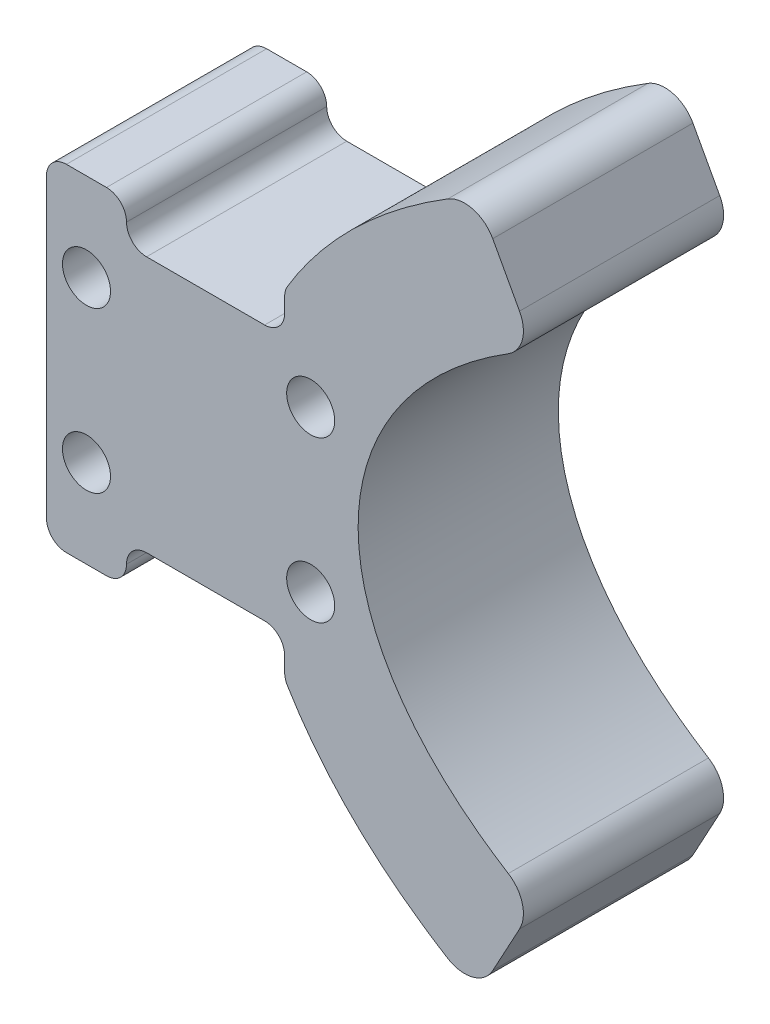
ISO-10303-21;
HEADER;
FILE_DESCRIPTION(('STEP AP214'),'2;1');
FILE_NAME('part.step','',(''),(''),'','','');
FILE_SCHEMA(('AUTOMOTIVE_DESIGN { 1 0 10303 214 1 1 1 1 }'));
ENDSEC;
DATA;
#1=APPLICATION_CONTEXT('core data for automotive mechanical design processes');
#2=APPLICATION_PROTOCOL_DEFINITION('international standard','automotive_design',2000,#1);
#3=PRODUCT_CONTEXT('',#1,'mechanical');
#4=PRODUCT('Part','Part','',(#3));
#5=PRODUCT_RELATED_PRODUCT_CATEGORY('part','',(#4));
#6=PRODUCT_DEFINITION_FORMATION('','',#4);
#7=PRODUCT_DEFINITION_CONTEXT('part definition',#1,'design');
#8=PRODUCT_DEFINITION('design','',#6,#7);
#9=PRODUCT_DEFINITION_SHAPE('','',#8);
#10=(LENGTH_UNIT() NAMED_UNIT(*) SI_UNIT(.MILLI.,.METRE.));
#11=(NAMED_UNIT(*) PLANE_ANGLE_UNIT() SI_UNIT($,.RADIAN.));
#12=(NAMED_UNIT(*) SI_UNIT($,.STERADIAN.) SOLID_ANGLE_UNIT());
#13=UNCERTAINTY_MEASURE_WITH_UNIT(LENGTH_MEASURE(1.E-05),#10,'distance_accuracy_value','');
#14=(GEOMETRIC_REPRESENTATION_CONTEXT(3) GLOBAL_UNCERTAINTY_ASSIGNED_CONTEXT((#13)) GLOBAL_UNIT_ASSIGNED_CONTEXT((#10,
#11,#12)) REPRESENTATION_CONTEXT('',''));
#15=CARTESIAN_POINT('',(0.,0.,0.));
#16=DIRECTION('',(0.,0.,1.));
#17=DIRECTION('',(1.,0.,0.));
#18=AXIS2_PLACEMENT_3D('',#15,#16,#17);
#19=CARTESIAN_POINT('',(-53.8006710617487,41.0742610538109,25.));
#20=CARTESIAN_POINT('',(-54.4876751397886,40.6518106219936,25.));
#21=CARTESIAN_POINT('',(-58.2021573977512,38.2846296165475,25.));
#22=CARTESIAN_POINT('',(-65.057392244549,32.9774389324644,25.));
#23=CARTESIAN_POINT('',(-72.9501008904915,23.9796695691526,25.));
#24=CARTESIAN_POINT('',(-78.6277299229918,12.6320572332366,25.));
#25=CARTESIAN_POINT('',(-80.6874585648177,0.00103574046310555,25.));
#26=CARTESIAN_POINT('',(-78.6279670369604,-12.6300244159745,25.));
#27=CARTESIAN_POINT('',(-72.9505510264958,-23.9777433321728,25.));
#28=CARTESIAN_POINT('',(-64.551684804824,-33.5529001395555,25.));
#29=CARTESIAN_POINT('',(-57.5719998963868,-38.7527788124292,25.));
#30=CARTESIAN_POINT('',(-53.8085864519297,-41.0684114465633,25.));
#31=CARTESIAN_POINT('',(-53.800589502817,-41.0733299336233,25.));
#32=B_SPLINE_CURVE_WITH_KNOTS('',3,(#19,#20,#21,#22,#23,#24,#25,#26,#27,#28,#29,#30,#31),
.UNSPECIFIED.,.F.,.F.,(4,1,1,1,1,1,1,1,1,1,4),(5.4973839267599,5.53329799862279,5.6941366846315,
5.89048622548086,6.08683576633022,6.28318530717959,6.47953484802895,6.67588438887831,
6.87223392972767,7.06858347057703,7.06900152213603),.UNSPECIFIED.);
#33=DIRECTION('',(0.,0.,-1.));
#34=VECTOR('',#33,1.);
#35=SURFACE_OF_LINEAR_EXTRUSION('',#32,#34);
#36=CARTESIAN_POINT('',(-73.819446938526,-21.6044429379773,25.));
#37=VERTEX_POINT('',#36);
#38=CARTESIAN_POINT('',(-53.800589502817,-41.0733299336232,25.));
#39=VERTEX_POINT('',#38);
#40=EDGE_CURVE('E223',#37,#39,#32,.T.);
#41=ORIENTED_EDGE('',*,*,#40,.F.);
#42=DIRECTION('',(0.,0.,-1.));
#43=VECTOR('',#42,1.);
#44=CARTESIAN_POINT('',(-73.819446938526,-21.6044429379772,25.));
#45=LINE('',#44,#43);
#46=CARTESIAN_POINT('',(-73.819446938526,-21.6044429379773,0.));
#47=VERTEX_POINT('',#46);
#48=EDGE_CURVE('E299',#37,#47,#45,.T.);
#49=ORIENTED_EDGE('',*,*,#48,.T.);
#50=CARTESIAN_POINT('',(-53.8006710617487,41.0742610538109,0.));
#51=CARTESIAN_POINT('',(-54.4876751397886,40.6518106219936,0.));
#52=CARTESIAN_POINT('',(-58.2021573977512,38.2846296165475,0.));
#53=CARTESIAN_POINT('',(-65.057392244549,32.9774389324644,0.));
#54=CARTESIAN_POINT('',(-72.9501008904915,23.9796695691526,0.));
#55=CARTESIAN_POINT('',(-78.6277299229918,12.6320572332366,0.));
#56=CARTESIAN_POINT('',(-80.6874585648177,0.00103574046310555,0.));
#57=CARTESIAN_POINT('',(-78.6279670369604,-12.6300244159745,0.));
#58=CARTESIAN_POINT('',(-72.9505510264958,-23.9777433321728,0.));
#59=CARTESIAN_POINT('',(-64.551684804824,-33.5529001395555,0.));
#60=CARTESIAN_POINT('',(-57.5719998963868,-38.7527788124292,0.));
#61=CARTESIAN_POINT('',(-53.8085864519297,-41.0684114465633,0.));
#62=CARTESIAN_POINT('',(-53.800589502817,-41.0733299336233,0.));
#63=B_SPLINE_CURVE_WITH_KNOTS('',3,(#50,#51,#52,#53,#54,#55,#56,#57,#58,#59,#60,#61,#62),
.UNSPECIFIED.,.F.,.F.,(4,1,1,1,1,1,1,1,1,1,4),(5.4973839267599,5.53329799862279,5.6941366846315,
5.89048622548086,6.08683576633022,6.28318530717959,6.47953484802895,6.67588438887831,
6.87223392972767,7.06858347057703,7.06900152213603),.UNSPECIFIED.);
#64=CARTESIAN_POINT('',(-53.800589502817,-41.0733299336232,0.));
#65=VERTEX_POINT('',#64);
#66=EDGE_CURVE('E468',#47,#65,#63,.T.);
#67=ORIENTED_EDGE('',*,*,#66,.T.);
#68=DIRECTION('',(0.,0.,-1.));
#69=VECTOR('',#68,1.);
#70=CARTESIAN_POINT('',(-53.800589502817,-41.0733299336232,25.));
#71=LINE('',#70,#69);
#72=EDGE_CURVE('E241',#39,#65,#71,.T.);
#73=ORIENTED_EDGE('',*,*,#72,.F.);
#74=EDGE_LOOP('',(#41,#49,#67,#73));
#75=FACE_BOUND('',#74,.T.);
#76=ADVANCED_FACE('F34',(#75),#35,.F.);
#77=CARTESIAN_POINT('',(-51.7054373517364,37.6669166772578,25.));
#78=DIRECTION('',(0.,0.,-1.));
#79=DIRECTION('',(-1.,0.,0.));
#80=AXIS2_PLACEMENT_3D('',#77,#78,#79);
#81=CYLINDRICAL_SURFACE('',#80,4.);
#82=CARTESIAN_POINT('',(-51.7054373517364,37.6669166772578,0.));
#83=DIRECTION('',(0.,0.,1.));
#84=DIRECTION('',(1.,0.,0.));
#85=AXIS2_PLACEMENT_3D('',#82,#83,#84);
#86=CIRCLE('',#85,4.);
#87=CARTESIAN_POINT('',(-48.189800950304,39.5748738814225,0.));
#88=VERTEX_POINT('',#87);
#89=CARTESIAN_POINT('',(-53.8006710617487,41.0742610538109,0.));
#90=VERTEX_POINT('',#89);
#91=EDGE_CURVE('E239',#88,#90,#86,.T.);
#92=ORIENTED_EDGE('',*,*,#91,.T.);
#93=DIRECTION('',(0.,0.,-1.));
#94=VECTOR('',#93,1.);
#95=CARTESIAN_POINT('',(-53.8006710617487,41.0742610538109,25.));
#96=LINE('',#95,#94);
#97=CARTESIAN_POINT('',(-53.8006710617487,41.0742610538109,25.));
#98=VERTEX_POINT('',#97);
#99=EDGE_CURVE('E217',#98,#90,#96,.T.);
#100=ORIENTED_EDGE('',*,*,#99,.F.);
#101=CARTESIAN_POINT('',(-51.7054373517364,37.6669166772578,25.));
#102=DIRECTION('',(0.,0.,1.));
#103=DIRECTION('',(1.,0.,0.));
#104=AXIS2_PLACEMENT_3D('',#101,#102,#103);
#105=CIRCLE('',#104,4.);
#106=CARTESIAN_POINT('',(-48.189800950304,39.5748738814225,25.));
#107=VERTEX_POINT('',#106);
#108=EDGE_CURVE('E226',#107,#98,#105,.T.);
#109=ORIENTED_EDGE('',*,*,#108,.F.);
#110=DIRECTION('',(0.,0.,-1.));
#111=VECTOR('',#110,1.);
#112=CARTESIAN_POINT('',(-48.189800950304,39.5748738814225,25.));
#113=LINE('',#112,#111);
#114=EDGE_CURVE('E534',#107,#88,#113,.T.);
#115=ORIENTED_EDGE('',*,*,#114,.T.);
#116=EDGE_LOOP('',(#92,#100,#109,#115));
#117=FACE_BOUND('',#116,.T.);
#118=ADVANCED_FACE('F237',(#117),#81,.T.);
#119=CARTESIAN_POINT('',(-73.8202230505995,21.6044190070564,0.));
#120=VERTEX_POINT('',#119);
#121=EDGE_CURVE('E509',#90,#120,#63,.T.);
#122=ORIENTED_EDGE('',*,*,#121,.T.);
#123=DIRECTION('',(0.,0.,-1.));
#124=VECTOR('',#123,1.);
#125=CARTESIAN_POINT('',(-73.8202230505995,21.6044190070564,0.));
#126=LINE('',#125,#124);
#127=CARTESIAN_POINT('',(-73.8202230505995,21.6044190070565,25.));
#128=VERTEX_POINT('',#127);
#129=EDGE_CURVE('E220',#120,#128,#126,.F.);
#130=ORIENTED_EDGE('',*,*,#129,.T.);
#131=EDGE_CURVE('E212',#98,#128,#32,.T.);
#132=ORIENTED_EDGE('',*,*,#131,.F.);
#133=ORIENTED_EDGE('',*,*,#99,.T.);
#134=EDGE_LOOP('',(#122,#130,#132,#133));
#135=FACE_BOUND('',#134,.T.);
#136=ADVANCED_FACE('F215',(#135),#35,.F.);
#137=CARTESIAN_POINT('',(-51.705038068818,-37.6661809513413,25.));
#138=DIRECTION('',(0.,0.,-1.));
#139=DIRECTION('',(-1.,0.,0.));
#140=AXIS2_PLACEMENT_3D('',#137,#138,#139);
#141=CYLINDRICAL_SURFACE('',#140,4.);
#142=CARTESIAN_POINT('',(-51.705038068818,-37.6661809513413,0.));
#143=DIRECTION('',(0.,0.,1.));
#144=DIRECTION('',(1.,0.,0.));
#145=AXIS2_PLACEMENT_3D('',#142,#143,#144);
#146=CIRCLE('',#145,4.);
#147=CARTESIAN_POINT('',(-48.1894016673856,-39.574138155506,0.));
#148=VERTEX_POINT('',#147);
#149=EDGE_CURVE('E510',#65,#148,#146,.T.);
#150=ORIENTED_EDGE('',*,*,#149,.T.);
#151=DIRECTION('',(0.,0.,-1.));
#152=VECTOR('',#151,1.);
#153=CARTESIAN_POINT('',(-48.1894016673856,-39.574138155506,25.));
#154=LINE('',#153,#152);
#155=CARTESIAN_POINT('',(-48.1894016673856,-39.574138155506,25.));
#156=VERTEX_POINT('',#155);
#157=EDGE_CURVE('E246',#156,#148,#154,.T.);
#158=ORIENTED_EDGE('',*,*,#157,.F.);
#159=CARTESIAN_POINT('',(-51.705038068818,-37.6661809513413,25.));
#160=DIRECTION('',(0.,0.,1.));
#161=DIRECTION('',(1.,0.,0.));
#162=AXIS2_PLACEMENT_3D('',#159,#160,#161);
#163=CIRCLE('',#162,4.);
#164=EDGE_CURVE('E222',#39,#156,#163,.T.);
#165=ORIENTED_EDGE('',*,*,#164,.F.);
#166=ORIENTED_EDGE('',*,*,#72,.T.);
#167=EDGE_LOOP('',(#150,#158,#165,#166));
#168=FACE_BOUND('',#167,.T.);
#169=ADVANCED_FACE('F400',(#168),#141,.T.);
#170=CARTESIAN_POINT('',(-20.6347318136508,11.1985941446677,25.));
#171=DIRECTION('',(0.878909100358085,-0.476989301041167,0.));
#172=DIRECTION('',(0.476989301041167,0.878909100358085,0.));
#173=AXIS2_PLACEMENT_3D('',#170,#171,#172);
#174=PLANE('',#173);
#175=DIRECTION('',(-0.476989301041167,-0.878909100358085,0.));
#176=VECTOR('',#175,1.);
#177=CARTESIAN_POINT('',(-20.6347318136508,11.1985941446677,0.));
#178=LINE('',#177,#176);
#179=CARTESIAN_POINT('',(-44.8449957199096,-33.4116753578872,0.));
#180=VERTEX_POINT('',#179);
#181=EDGE_CURVE('E513',#180,#148,#178,.T.);
#182=ORIENTED_EDGE('',*,*,#181,.F.);
#183=DIRECTION('',(0.,0.,-1.));
#184=VECTOR('',#183,1.);
#185=CARTESIAN_POINT('',(-44.8449957199096,-33.4116753578872,25.));
#186=LINE('',#185,#184);
#187=CARTESIAN_POINT('',(-44.8449957199096,-33.4116753578872,25.));
#188=VERTEX_POINT('',#187);
#189=EDGE_CURVE('E543',#188,#180,#186,.T.);
#190=ORIENTED_EDGE('',*,*,#189,.F.);
#191=DIRECTION('',(-0.476989301041167,-0.878909100358085,0.));
#192=VECTOR('',#191,1.);
#193=CARTESIAN_POINT('',(-20.6347318136508,11.1985941446677,25.));
#194=LINE('',#193,#192);
#195=EDGE_CURVE('E550',#188,#156,#194,.T.);
#196=ORIENTED_EDGE('',*,*,#195,.T.);
#197=ORIENTED_EDGE('',*,*,#157,.T.);
#198=EDGE_LOOP('',(#182,#190,#196,#197));
#199=FACE_BOUND('',#198,.T.);
#200=ADVANCED_FACE('F548',(#199),#174,.T.);
#201=CARTESIAN_POINT('',(-48.360632121342,-31.5037181537226,25.));
#202=DIRECTION('',(0.,0.,-1.));
#203=DIRECTION('',(-1.,0.,0.));
#204=AXIS2_PLACEMENT_3D('',#201,#202,#203);
#205=CYLINDRICAL_SURFACE('',#204,3.99999999999999);
#206=CARTESIAN_POINT('',(-48.360632121342,-31.5037181537226,0.));
#207=DIRECTION('',(0.,0.,1.));
#208=DIRECTION('',(1.,0.,0.));
#209=AXIS2_PLACEMENT_3D('',#206,#207,#208);
#210=CIRCLE('',#209,3.99999999999999);
#211=CARTESIAN_POINT('',(-46.2454078372289,-28.1087474280906,0.));
#212=VERTEX_POINT('',#211);
#213=EDGE_CURVE('E525',#212,#180,#210,.F.);
#214=ORIENTED_EDGE('',*,*,#213,.F.);
#215=DIRECTION('',(0.,0.,-1.));
#216=VECTOR('',#215,1.);
#217=CARTESIAN_POINT('',(-46.2454078372289,-28.1087474280906,25.));
#218=LINE('',#217,#216);
#219=CARTESIAN_POINT('',(-46.2454078372289,-28.1087474280906,25.));
#220=VERTEX_POINT('',#219);
#221=EDGE_CURVE('E541',#220,#212,#218,.T.);
#222=ORIENTED_EDGE('',*,*,#221,.F.);
#223=CARTESIAN_POINT('',(-48.360632121342,-31.5037181537226,25.));
#224=DIRECTION('',(0.,0.,1.));
#225=DIRECTION('',(1.,0.,0.));
#226=AXIS2_PLACEMENT_3D('',#223,#224,#225);
#227=CIRCLE('',#226,3.99999999999999);
#228=EDGE_CURVE('E559',#220,#188,#227,.F.);
#229=ORIENTED_EDGE('',*,*,#228,.T.);
#230=ORIENTED_EDGE('',*,*,#189,.T.);
#231=EDGE_LOOP('',(#214,#222,#229,#230));
#232=FACE_BOUND('',#231,.T.);
#233=ADVANCED_FACE('F556',(#232),#205,.T.);
#234=CARTESIAN_POINT('',(0.,0.,25.));
#235=DIRECTION('',(0.,0.,1.));
#236=DIRECTION('',(-1.,0.,0.));
#237=AXIS2_PLACEMENT_3D('',#234,#235,#236);
#238=ELLIPSE('',#237,65.,40.);
#239=DIRECTION('',(0.,0.,-1.));
#240=VECTOR('',#239,1.);
#241=SURFACE_OF_LINEAR_EXTRUSION('',#238,#240);
#242=CARTESIAN_POINT('',(0.,0.,0.));
#243=DIRECTION('',(0.,0.,1.));
#244=DIRECTION('',(-1.,0.,0.));
#245=AXIS2_PLACEMENT_3D('',#242,#243,#244);
#246=ELLIPSE('',#245,65.,40.);
#247=CARTESIAN_POINT('',(-46.2454078372289,28.1087474280905,0.));
#248=VERTEX_POINT('',#247);
#249=EDGE_CURVE('E528',#248,#212,#246,.T.);
#250=ORIENTED_EDGE('',*,*,#249,.F.);
#251=DIRECTION('',(0.,0.,-1.));
#252=VECTOR('',#251,1.);
#253=CARTESIAN_POINT('',(-46.2454078372289,28.1087474280905,25.));
#254=LINE('',#253,#252);
#255=CARTESIAN_POINT('',(-46.2454078372289,28.1087474280905,25.));
#256=VERTEX_POINT('',#255);
#257=EDGE_CURVE('E539',#256,#248,#254,.T.);
#258=ORIENTED_EDGE('',*,*,#257,.F.);
#259=EDGE_CURVE('E562',#256,#220,#238,.T.);
#260=ORIENTED_EDGE('',*,*,#259,.T.);
#261=ORIENTED_EDGE('',*,*,#221,.T.);
#262=EDGE_LOOP('',(#250,#258,#260,#261));
#263=FACE_BOUND('',#262,.T.);
#264=ADVANCED_FACE('F570',(#263),#241,.T.);
#265=CARTESIAN_POINT('',(-48.360632121342,31.5037181537226,25.));
#266=DIRECTION('',(0.,0.,-1.));
#267=DIRECTION('',(-1.,0.,0.));
#268=AXIS2_PLACEMENT_3D('',#265,#266,#267);
#269=CYLINDRICAL_SURFACE('',#268,4.);
#270=CARTESIAN_POINT('',(-48.360632121342,31.5037181537226,0.));
#271=DIRECTION('',(0.,0.,1.));
#272=DIRECTION('',(1.,0.,0.));
#273=AXIS2_PLACEMENT_3D('',#270,#271,#272);
#274=CIRCLE('',#273,4.);
#275=CARTESIAN_POINT('',(-44.8449957199096,33.4116753578872,0.));
#276=VERTEX_POINT('',#275);
#277=EDGE_CURVE('E531',#248,#276,#274,.T.);
#278=ORIENTED_EDGE('',*,*,#277,.T.);
#279=DIRECTION('',(0.,0.,-1.));
#280=VECTOR('',#279,1.);
#281=CARTESIAN_POINT('',(-44.8449957199096,33.4116753578872,25.));
#282=LINE('',#281,#280);
#283=CARTESIAN_POINT('',(-44.8449957199096,33.4116753578872,25.));
#284=VERTEX_POINT('',#283);
#285=EDGE_CURVE('E536',#284,#276,#282,.T.);
#286=ORIENTED_EDGE('',*,*,#285,.F.);
#287=CARTESIAN_POINT('',(-48.360632121342,31.5037181537226,25.));
#288=DIRECTION('',(0.,0.,1.));
#289=DIRECTION('',(1.,0.,0.));
#290=AXIS2_PLACEMENT_3D('',#287,#288,#289);
#291=CIRCLE('',#290,4.);
#292=EDGE_CURVE('E567',#256,#284,#291,.T.);
#293=ORIENTED_EDGE('',*,*,#292,.F.);
#294=ORIENTED_EDGE('',*,*,#257,.T.);
#295=EDGE_LOOP('',(#278,#286,#293,#294));
#296=FACE_BOUND('',#295,.T.);
#297=ADVANCED_FACE('F408',(#296),#269,.T.);
#298=CARTESIAN_POINT('',(-70.9234880380778,10.,25.));
#299=DIRECTION('',(0.,0.,-1.));
#300=DIRECTION('',(-1.,0.,0.));
#301=AXIS2_PLACEMENT_3D('',#298,#299,#300);
#302=CYLINDRICAL_SURFACE('',#301,3.00000000000001);
#303=CARTESIAN_POINT('',(-70.9234880380778,10.,25.));
#304=DIRECTION('',(0.,0.,1.));
#305=DIRECTION('',(1.,0.,0.));
#306=AXIS2_PLACEMENT_3D('',#303,#304,#305);
#307=CIRCLE('',#306,3.00000000000001);
#308=CARTESIAN_POINT('',(-67.9234880380778,10.,25.));
#309=VERTEX_POINT('',#308);
#310=EDGE_CURVE('E235',#309,#309,#307,.T.);
#311=ORIENTED_EDGE('',*,*,#310,.T.);
#312=EDGE_LOOP('',(#311));
#313=FACE_BOUND('',#312,.T.);
#314=CARTESIAN_POINT('',(-70.9234880380778,10.,0.));
#315=DIRECTION('',(0.,0.,1.));
#316=DIRECTION('',(1.,0.,0.));
#317=AXIS2_PLACEMENT_3D('',#314,#315,#316);
#318=CIRCLE('',#317,3.00000000000001);
#319=CARTESIAN_POINT('',(-67.9234880380778,10.,0.));
#320=VERTEX_POINT('',#319);
#321=EDGE_CURVE('E792',#320,#320,#318,.T.);
#322=ORIENTED_EDGE('',*,*,#321,.F.);
#323=EDGE_LOOP('',(#322));
#324=FACE_BOUND('',#323,.T.);
#325=ADVANCED_FACE('F404',(#313,#324),#302,.F.);
#326=CARTESIAN_POINT('',(-70.9234880380778,-10.,25.));
#327=DIRECTION('',(0.,0.,-1.));
#328=DIRECTION('',(-1.,0.,0.));
#329=AXIS2_PLACEMENT_3D('',#326,#327,#328);
#330=CYLINDRICAL_SURFACE('',#329,3.00000000000001);
#331=CARTESIAN_POINT('',(-70.9234880380778,-10.,25.));
#332=DIRECTION('',(0.,0.,1.));
#333=DIRECTION('',(1.,0.,0.));
#334=AXIS2_PLACEMENT_3D('',#331,#332,#333);
#335=CIRCLE('',#334,3.00000000000001);
#336=CARTESIAN_POINT('',(-67.9234880380778,-10.,25.));
#337=VERTEX_POINT('',#336);
#338=EDGE_CURVE('E383',#337,#337,#335,.F.);
#339=ORIENTED_EDGE('',*,*,#338,.F.);
#340=EDGE_LOOP('',(#339));
#341=FACE_BOUND('',#340,.T.);
#342=CARTESIAN_POINT('',(-70.9234880380778,-10.,0.));
#343=DIRECTION('',(0.,0.,1.));
#344=DIRECTION('',(1.,0.,0.));
#345=AXIS2_PLACEMENT_3D('',#342,#343,#344);
#346=CIRCLE('',#345,3.00000000000001);
#347=CARTESIAN_POINT('',(-67.9234880380778,-10.,0.));
#348=VERTEX_POINT('',#347);
#349=EDGE_CURVE('E382',#348,#348,#346,.F.);
#350=ORIENTED_EDGE('',*,*,#349,.T.);
#351=EDGE_LOOP('',(#350));
#352=FACE_BOUND('',#351,.T.);
#353=ADVANCED_FACE('F407',(#341,#352),#330,.F.);
#354=CARTESIAN_POINT('',(-20.6347318136515,-11.1985941446677,25.));
#355=DIRECTION('',(-0.878909100358091,-0.476989301041156,0.));
#356=DIRECTION('',(0.476989301041156,-0.878909100358091,0.));
#357=AXIS2_PLACEMENT_3D('',#354,#355,#356);
#358=PLANE('',#357);
#359=DIRECTION('',(-0.476989301041156,0.878909100358091,0.));
#360=VECTOR('',#359,1.);
#361=CARTESIAN_POINT('',(-20.6347318136515,-11.1985941446677,0.));
#362=LINE('',#361,#360);
#363=EDGE_CURVE('E386',#276,#88,#362,.T.);
#364=ORIENTED_EDGE('',*,*,#363,.T.);
#365=ORIENTED_EDGE('',*,*,#114,.F.);
#366=DIRECTION('',(-0.476989301041156,0.878909100358091,0.));
#367=VECTOR('',#366,1.);
#368=CARTESIAN_POINT('',(-20.6347318136515,-11.1985941446677,25.));
#369=LINE('',#368,#367);
#370=EDGE_CURVE('E231',#284,#107,#369,.T.);
#371=ORIENTED_EDGE('',*,*,#370,.F.);
#372=ORIENTED_EDGE('',*,*,#285,.T.);
#373=EDGE_LOOP('',(#364,#365,#371,#372));
#374=FACE_BOUND('',#373,.T.);
#375=ADVANCED_FACE('F412',(#374),#358,.F.);
#376=CARTESIAN_POINT('',(0.,0.,25.));
#377=DIRECTION('',(0.,0.,1.));
#378=DIRECTION('',(1.,0.,0.));
#379=AXIS2_PLACEMENT_3D('',#376,#377,#378);
#380=PLANE('',#379);
#381=CARTESIAN_POINT('',(-98.9234880380778,10.,25.));
#382=DIRECTION('',(0.,0.,1.));
#383=DIRECTION('',(1.,0.,0.));
#384=AXIS2_PLACEMENT_3D('',#381,#382,#383);
#385=CIRCLE('',#384,3.00000000000001);
#386=CARTESIAN_POINT('',(-95.9234880380778,10.,25.));
#387=VERTEX_POINT('',#386);
#388=EDGE_CURVE('E333',#387,#387,#385,.T.);
#389=ORIENTED_EDGE('',*,*,#388,.F.);
#390=EDGE_LOOP('',(#389));
#391=FACE_BOUND('',#390,.T.);
#392=CARTESIAN_POINT('',(-98.9234880380778,-10.,25.));
#393=DIRECTION('',(0.,0.,1.));
#394=DIRECTION('',(1.,0.,0.));
#395=AXIS2_PLACEMENT_3D('',#392,#393,#394);
#396=CIRCLE('',#395,3.00000000000001);
#397=CARTESIAN_POINT('',(-95.9234880380778,-10.,25.));
#398=VERTEX_POINT('',#397);
#399=EDGE_CURVE('E343',#398,#398,#396,.T.);
#400=ORIENTED_EDGE('',*,*,#399,.F.);
#401=EDGE_LOOP('',(#400));
#402=FACE_BOUND('',#401,.T.);
#403=DIRECTION('',(1.,0.,0.));
#404=VECTOR('',#403,1.);
#405=CARTESIAN_POINT('',(-93.9234880380778,16.,25.));
#406=LINE('',#405,#404);
#407=CARTESIAN_POINT('',(-91.4234880380778,16.,25.));
#408=VERTEX_POINT('',#407);
#409=CARTESIAN_POINT('',(-76.6773293506342,16.,25.));
#410=VERTEX_POINT('',#409);
#411=EDGE_CURVE('E354',#408,#410,#406,.T.);
#412=ORIENTED_EDGE('',*,*,#411,.F.);
#413=CARTESIAN_POINT('',(-91.4234880380778,18.5,25.));
#414=DIRECTION('',(0.,0.,1.));
#415=DIRECTION('',(1.,0.,0.));
#416=AXIS2_PLACEMENT_3D('',#413,#414,#415);
#417=CIRCLE('',#416,2.5);
#418=CARTESIAN_POINT('',(-93.9234880380778,18.5,25.));
#419=VERTEX_POINT('',#418);
#420=EDGE_CURVE('E307',#408,#419,#417,.F.);
#421=ORIENTED_EDGE('',*,*,#420,.T.);
#422=CARTESIAN_POINT('',(-96.4234880380778,18.5,25.));
#423=DIRECTION('',(0.,0.,1.));
#424=DIRECTION('',(1.,0.,0.));
#425=AXIS2_PLACEMENT_3D('',#422,#423,#424);
#426=CIRCLE('',#425,2.5);
#427=CARTESIAN_POINT('',(-96.4234880380778,21.,25.));
#428=VERTEX_POINT('',#427);
#429=EDGE_CURVE('E262',#419,#428,#426,.T.);
#430=ORIENTED_EDGE('',*,*,#429,.T.);
#431=DIRECTION('',(-1.,0.,0.));
#432=VECTOR('',#431,1.);
#433=CARTESIAN_POINT('',(-74.1773293512183,21.,25.));
#434=LINE('',#433,#432);
#435=CARTESIAN_POINT('',(-101.426591357335,21.,25.));
#436=VERTEX_POINT('',#435);
#437=EDGE_CURVE('E353',#428,#436,#434,.T.);
#438=ORIENTED_EDGE('',*,*,#437,.T.);
#439=CARTESIAN_POINT('',(-101.426591357335,18.5,25.));
#440=DIRECTION('',(0.,0.,1.));
#441=DIRECTION('',(1.,0.,0.));
#442=AXIS2_PLACEMENT_3D('',#439,#440,#441);
#443=CIRCLE('',#442,2.5);
#444=CARTESIAN_POINT('',(-103.926591357335,18.5,25.));
#445=VERTEX_POINT('',#444);
#446=EDGE_CURVE('E252',#436,#445,#443,.T.);
#447=ORIENTED_EDGE('',*,*,#446,.T.);
#448=DIRECTION('',(0.,-1.,0.));
#449=VECTOR('',#448,1.);
#450=CARTESIAN_POINT('',(-103.926591357335,21.,25.));
#451=LINE('',#450,#449);
#452=CARTESIAN_POINT('',(-103.926591357335,-18.5,25.));
#453=VERTEX_POINT('',#452);
#454=EDGE_CURVE('E376',#445,#453,#451,.T.);
#455=ORIENTED_EDGE('',*,*,#454,.T.);
#456=CARTESIAN_POINT('',(-101.426591357335,-18.5,25.));
#457=DIRECTION('',(0.,0.,1.));
#458=DIRECTION('',(1.,0.,0.));
#459=AXIS2_PLACEMENT_3D('',#456,#457,#458);
#460=CIRCLE('',#459,2.5);
#461=CARTESIAN_POINT('',(-101.426591357335,-21.,25.));
#462=VERTEX_POINT('',#461);
#463=EDGE_CURVE('E260',#453,#462,#460,.T.);
#464=ORIENTED_EDGE('',*,*,#463,.T.);
#465=DIRECTION('',(1.,0.,0.));
#466=VECTOR('',#465,1.);
#467=CARTESIAN_POINT('',(-103.926591357335,-21.,25.));
#468=LINE('',#467,#466);
#469=CARTESIAN_POINT('',(-96.4234880380778,-21.,25.));
#470=VERTEX_POINT('',#469);
#471=EDGE_CURVE('E370',#462,#470,#468,.T.);
#472=ORIENTED_EDGE('',*,*,#471,.T.);
#473=CARTESIAN_POINT('',(-96.4234880380778,-18.5,25.));
#474=DIRECTION('',(0.,0.,1.));
#475=DIRECTION('',(1.,0.,0.));
#476=AXIS2_PLACEMENT_3D('',#473,#474,#475);
#477=CIRCLE('',#476,2.5);
#478=CARTESIAN_POINT('',(-93.9234880380778,-18.5,25.));
#479=VERTEX_POINT('',#478);
#480=EDGE_CURVE('E258',#470,#479,#477,.T.);
#481=ORIENTED_EDGE('',*,*,#480,.T.);
#482=CARTESIAN_POINT('',(-91.4234880380778,-18.5,25.));
#483=DIRECTION('',(0.,0.,1.));
#484=DIRECTION('',(1.,0.,0.));
#485=AXIS2_PLACEMENT_3D('',#482,#483,#484);
#486=CIRCLE('',#485,2.5);
#487=CARTESIAN_POINT('',(-91.4234880380778,-16.,25.));
#488=VERTEX_POINT('',#487);
#489=EDGE_CURVE('E311',#479,#488,#486,.F.);
#490=ORIENTED_EDGE('',*,*,#489,.T.);
#491=DIRECTION('',(-1.,0.,0.));
#492=VECTOR('',#491,1.);
#493=CARTESIAN_POINT('',(-74.1765913573347,-16.,25.));
#494=LINE('',#493,#492);
#495=CARTESIAN_POINT('',(-76.6765913573347,-16.,25.));
#496=VERTEX_POINT('',#495);
#497=EDGE_CURVE('E325',#496,#488,#494,.T.);
#498=ORIENTED_EDGE('',*,*,#497,.F.);
#499=CARTESIAN_POINT('',(-76.6765913573347,-18.5,25.));
#500=DIRECTION('',(0.,0.,1.));
#501=DIRECTION('',(1.,0.,0.));
#502=AXIS2_PLACEMENT_3D('',#499,#500,#501);
#503=CIRCLE('',#502,2.5);
#504=CARTESIAN_POINT('',(-74.1765913573347,-18.5,25.));
#505=VERTEX_POINT('',#504);
#506=EDGE_CURVE('E315',#496,#505,#503,.F.);
#507=ORIENTED_EDGE('',*,*,#506,.T.);
#508=DIRECTION('',(0.,1.,0.));
#509=VECTOR('',#508,1.);
#510=CARTESIAN_POINT('',(-74.1765913573347,-21.0000000000012,25.));
#511=LINE('',#510,#509);
#512=CARTESIAN_POINT('',(-74.1765913573347,-20.3167434551174,25.));
#513=VERTEX_POINT('',#512);
#514=EDGE_CURVE('E321',#513,#505,#511,.T.);
#515=ORIENTED_EDGE('',*,*,#514,.F.);
#516=CARTESIAN_POINT('',(-71.6765913573347,-20.3167434551174,25.));
#517=DIRECTION('',(0.,0.,1.));
#518=DIRECTION('',(1.,0.,0.));
#519=AXIS2_PLACEMENT_3D('',#516,#517,#518);
#520=CIRCLE('',#519,2.5);
#521=EDGE_CURVE('E256',#513,#37,#520,.T.);
#522=ORIENTED_EDGE('',*,*,#521,.T.);
#523=ORIENTED_EDGE('',*,*,#40,.T.);
#524=ORIENTED_EDGE('',*,*,#164,.T.);
#525=ORIENTED_EDGE('',*,*,#195,.F.);
#526=ORIENTED_EDGE('',*,*,#228,.F.);
#527=ORIENTED_EDGE('',*,*,#259,.F.);
#528=ORIENTED_EDGE('',*,*,#292,.T.);
#529=ORIENTED_EDGE('',*,*,#370,.T.);
#530=ORIENTED_EDGE('',*,*,#108,.T.);
#531=ORIENTED_EDGE('',*,*,#131,.T.);
#532=CARTESIAN_POINT('',(-71.6773293506341,20.3167829596234,25.));
#533=DIRECTION('',(0.,0.,1.));
#534=DIRECTION('',(1.,0.,0.));
#535=AXIS2_PLACEMENT_3D('',#532,#533,#534);
#536=CIRCLE('',#535,2.5);
#537=CARTESIAN_POINT('',(-74.1773293506342,20.3167829596234,25.));
#538=VERTEX_POINT('',#537);
#539=EDGE_CURVE('E254',#128,#538,#536,.T.);
#540=ORIENTED_EDGE('',*,*,#539,.T.);
#541=DIRECTION('',(0.,1.,0.));
#542=VECTOR('',#541,1.);
#543=CARTESIAN_POINT('',(-74.1773293506342,16.,25.));
#544=LINE('',#543,#542);
#545=CARTESIAN_POINT('',(-74.1773293506342,18.5,25.));
#546=VERTEX_POINT('',#545);
#547=EDGE_CURVE('E350',#546,#538,#544,.T.);
#548=ORIENTED_EDGE('',*,*,#547,.F.);
#549=CARTESIAN_POINT('',(-76.6773293506342,18.5,25.));
#550=DIRECTION('',(0.,0.,1.));
#551=DIRECTION('',(1.,0.,0.));
#552=AXIS2_PLACEMENT_3D('',#549,#550,#551);
#553=CIRCLE('',#552,2.5);
#554=EDGE_CURVE('E43',#546,#410,#553,.F.);
#555=ORIENTED_EDGE('',*,*,#554,.T.);
#556=EDGE_LOOP('',(#412,#421,#430,#438,#447,#455,#464,#472,#481,#490,#498,#507,#515,#522,#523,
#524,#525,#526,#527,#528,#529,#530,#531,#540,#548,#555));
#557=FACE_BOUND('',#556,.T.);
#558=ORIENTED_EDGE('',*,*,#338,.T.);
#559=EDGE_LOOP('',(#558));
#560=FACE_BOUND('',#559,.T.);
#561=ORIENTED_EDGE('',*,*,#310,.F.);
#562=EDGE_LOOP('',(#561));
#563=FACE_BOUND('',#562,.T.);
#564=ADVANCED_FACE('F228',(#391,#402,#557,#560,#563),#380,.T.);
#565=CARTESIAN_POINT('',(0.,0.,0.));
#566=DIRECTION('',(0.,0.,1.));
#567=DIRECTION('',(1.,0.,0.));
#568=AXIS2_PLACEMENT_3D('',#565,#566,#567);
#569=PLANE('',#568);
#570=CARTESIAN_POINT('',(-98.9234880380778,10.,0.));
#571=DIRECTION('',(0.,0.,1.));
#572=DIRECTION('',(1.,0.,0.));
#573=AXIS2_PLACEMENT_3D('',#570,#571,#572);
#574=CIRCLE('',#573,3.00000000000001);
#575=CARTESIAN_POINT('',(-95.9234880380778,10.,0.));
#576=VERTEX_POINT('',#575);
#577=EDGE_CURVE('E328',#576,#576,#574,.T.);
#578=ORIENTED_EDGE('',*,*,#577,.T.);
#579=EDGE_LOOP('',(#578));
#580=FACE_BOUND('',#579,.T.);
#581=CARTESIAN_POINT('',(-98.9234880380778,-10.,0.));
#582=DIRECTION('',(0.,0.,1.));
#583=DIRECTION('',(1.,0.,0.));
#584=AXIS2_PLACEMENT_3D('',#581,#582,#583);
#585=CIRCLE('',#584,3.00000000000001);
#586=CARTESIAN_POINT('',(-95.9234880380778,-10.,0.));
#587=VERTEX_POINT('',#586);
#588=EDGE_CURVE('E338',#587,#587,#585,.T.);
#589=ORIENTED_EDGE('',*,*,#588,.T.);
#590=EDGE_LOOP('',(#589));
#591=FACE_BOUND('',#590,.T.);
#592=ORIENTED_EDGE('',*,*,#349,.F.);
#593=EDGE_LOOP('',(#592));
#594=FACE_BOUND('',#593,.T.);
#595=ORIENTED_EDGE('',*,*,#321,.T.);
#596=EDGE_LOOP('',(#595));
#597=FACE_BOUND('',#596,.T.);
#598=DIRECTION('',(1.,0.,0.));
#599=VECTOR('',#598,1.);
#600=CARTESIAN_POINT('',(-74.1773293512183,21.,0.));
#601=LINE('',#600,#599);
#602=CARTESIAN_POINT('',(-101.426591357335,21.,0.));
#603=VERTEX_POINT('',#602);
#604=CARTESIAN_POINT('',(-96.4234880380778,21.,0.));
#605=VERTEX_POINT('',#604);
#606=EDGE_CURVE('E373',#603,#605,#601,.T.);
#607=ORIENTED_EDGE('',*,*,#606,.T.);
#608=CARTESIAN_POINT('',(-96.4234880380778,18.5,0.));
#609=DIRECTION('',(0.,0.,1.));
#610=DIRECTION('',(1.,0.,0.));
#611=AXIS2_PLACEMENT_3D('',#608,#609,#610);
#612=CIRCLE('',#611,2.5);
#613=CARTESIAN_POINT('',(-93.9234880380778,18.5,0.));
#614=VERTEX_POINT('',#613);
#615=EDGE_CURVE('E51',#605,#614,#612,.F.);
#616=ORIENTED_EDGE('',*,*,#615,.T.);
#617=CARTESIAN_POINT('',(-91.4234880380778,18.5,0.));
#618=DIRECTION('',(0.,0.,1.));
#619=DIRECTION('',(1.,0.,0.));
#620=AXIS2_PLACEMENT_3D('',#617,#618,#619);
#621=CIRCLE('',#620,2.5);
#622=CARTESIAN_POINT('',(-91.4234880380778,16.,0.));
#623=VERTEX_POINT('',#622);
#624=EDGE_CURVE('E309',#614,#623,#621,.T.);
#625=ORIENTED_EDGE('',*,*,#624,.T.);
#626=DIRECTION('',(1.,0.,0.));
#627=VECTOR('',#626,1.);
#628=CARTESIAN_POINT('',(-93.9234880380778,16.,0.));
#629=LINE('',#628,#627);
#630=CARTESIAN_POINT('',(-76.6773293506342,16.,0.));
#631=VERTEX_POINT('',#630);
#632=EDGE_CURVE('E346',#623,#631,#629,.T.);
#633=ORIENTED_EDGE('',*,*,#632,.T.);
#634=CARTESIAN_POINT('',(-76.6773293506342,18.5,0.));
#635=DIRECTION('',(0.,0.,1.));
#636=DIRECTION('',(1.,0.,0.));
#637=AXIS2_PLACEMENT_3D('',#634,#635,#636);
#638=CIRCLE('',#637,2.5);
#639=CARTESIAN_POINT('',(-74.1773293506342,18.5,0.));
#640=VERTEX_POINT('',#639);
#641=EDGE_CURVE('E11',#631,#640,#638,.T.);
#642=ORIENTED_EDGE('',*,*,#641,.T.);
#643=DIRECTION('',(0.,1.,0.));
#644=VECTOR('',#643,1.);
#645=CARTESIAN_POINT('',(-74.1773293506342,16.,0.));
#646=LINE('',#645,#644);
#647=CARTESIAN_POINT('',(-74.1773293506342,20.3167829596234,0.));
#648=VERTEX_POINT('',#647);
#649=EDGE_CURVE('E349',#640,#648,#646,.T.);
#650=ORIENTED_EDGE('',*,*,#649,.T.);
#651=CARTESIAN_POINT('',(-71.6773293506341,20.3167829596234,0.));
#652=DIRECTION('',(0.,0.,1.));
#653=DIRECTION('',(1.,0.,0.));
#654=AXIS2_PLACEMENT_3D('',#651,#652,#653);
#655=CIRCLE('',#654,2.5);
#656=EDGE_CURVE('E271',#648,#120,#655,.F.);
#657=ORIENTED_EDGE('',*,*,#656,.T.);
#658=ORIENTED_EDGE('',*,*,#121,.F.);
#659=ORIENTED_EDGE('',*,*,#91,.F.);
#660=ORIENTED_EDGE('',*,*,#363,.F.);
#661=ORIENTED_EDGE('',*,*,#277,.F.);
#662=ORIENTED_EDGE('',*,*,#249,.T.);
#663=ORIENTED_EDGE('',*,*,#213,.T.);
#664=ORIENTED_EDGE('',*,*,#181,.T.);
#665=ORIENTED_EDGE('',*,*,#149,.F.);
#666=ORIENTED_EDGE('',*,*,#66,.F.);
#667=CARTESIAN_POINT('',(-71.6765913573347,-20.3167434551174,0.));
#668=DIRECTION('',(0.,0.,1.));
#669=DIRECTION('',(1.,0.,0.));
#670=AXIS2_PLACEMENT_3D('',#667,#668,#669);
#671=CIRCLE('',#670,2.5);
#672=CARTESIAN_POINT('',(-74.1765913573347,-20.3167434551174,0.));
#673=VERTEX_POINT('',#672);
#674=EDGE_CURVE('E273',#47,#673,#671,.F.);
#675=ORIENTED_EDGE('',*,*,#674,.T.);
#676=DIRECTION('',(0.,1.,0.));
#677=VECTOR('',#676,1.);
#678=CARTESIAN_POINT('',(-74.1765913573347,-21.0000000000012,0.));
#679=LINE('',#678,#677);
#680=CARTESIAN_POINT('',(-74.1765913573347,-18.5,0.));
#681=VERTEX_POINT('',#680);
#682=EDGE_CURVE('E360',#673,#681,#679,.T.);
#683=ORIENTED_EDGE('',*,*,#682,.T.);
#684=CARTESIAN_POINT('',(-76.6765913573347,-18.5,0.));
#685=DIRECTION('',(0.,0.,1.));
#686=DIRECTION('',(1.,0.,0.));
#687=AXIS2_PLACEMENT_3D('',#684,#685,#686);
#688=CIRCLE('',#687,2.5);
#689=CARTESIAN_POINT('',(-76.6765913573347,-16.,0.));
#690=VERTEX_POINT('',#689);
#691=EDGE_CURVE('E317',#681,#690,#688,.T.);
#692=ORIENTED_EDGE('',*,*,#691,.T.);
#693=DIRECTION('',(-1.,0.,0.));
#694=VECTOR('',#693,1.);
#695=CARTESIAN_POINT('',(-74.1765913573347,-16.,0.));
#696=LINE('',#695,#694);
#697=CARTESIAN_POINT('',(-91.4234880380778,-16.,0.));
#698=VERTEX_POINT('',#697);
#699=EDGE_CURVE('E357',#690,#698,#696,.T.);
#700=ORIENTED_EDGE('',*,*,#699,.T.);
#701=CARTESIAN_POINT('',(-91.4234880380778,-18.5,0.));
#702=DIRECTION('',(0.,0.,1.));
#703=DIRECTION('',(1.,0.,0.));
#704=AXIS2_PLACEMENT_3D('',#701,#702,#703);
#705=CIRCLE('',#704,2.5);
#706=CARTESIAN_POINT('',(-93.9234880380778,-18.5,0.));
#707=VERTEX_POINT('',#706);
#708=EDGE_CURVE('E313',#698,#707,#705,.T.);
#709=ORIENTED_EDGE('',*,*,#708,.T.);
#710=CARTESIAN_POINT('',(-96.4234880380778,-18.5,0.));
#711=DIRECTION('',(0.,0.,1.));
#712=DIRECTION('',(1.,0.,0.));
#713=AXIS2_PLACEMENT_3D('',#710,#711,#712);
#714=CIRCLE('',#713,2.5);
#715=CARTESIAN_POINT('',(-96.4234880380778,-21.,0.));
#716=VERTEX_POINT('',#715);
#717=EDGE_CURVE('E275',#707,#716,#714,.F.);
#718=ORIENTED_EDGE('',*,*,#717,.T.);
#719=DIRECTION('',(-1.,0.,0.));
#720=VECTOR('',#719,1.);
#721=CARTESIAN_POINT('',(-103.926591357335,-21.,0.));
#722=LINE('',#721,#720);
#723=CARTESIAN_POINT('',(-101.426591357335,-21.,0.));
#724=VERTEX_POINT('',#723);
#725=EDGE_CURVE('E369',#716,#724,#722,.T.);
#726=ORIENTED_EDGE('',*,*,#725,.T.);
#727=CARTESIAN_POINT('',(-101.426591357335,-18.5,0.));
#728=DIRECTION('',(0.,0.,1.));
#729=DIRECTION('',(1.,0.,0.));
#730=AXIS2_PLACEMENT_3D('',#727,#728,#729);
#731=CIRCLE('',#730,2.5);
#732=CARTESIAN_POINT('',(-103.926591357335,-18.5,0.));
#733=VERTEX_POINT('',#732);
#734=EDGE_CURVE('E277',#724,#733,#731,.F.);
#735=ORIENTED_EDGE('',*,*,#734,.T.);
#736=DIRECTION('',(0.,1.,0.));
#737=VECTOR('',#736,1.);
#738=CARTESIAN_POINT('',(-103.926591357335,21.,0.));
#739=LINE('',#738,#737);
#740=CARTESIAN_POINT('',(-103.926591357335,18.5,0.));
#741=VERTEX_POINT('',#740);
#742=EDGE_CURVE('E367',#733,#741,#739,.T.);
#743=ORIENTED_EDGE('',*,*,#742,.T.);
#744=CARTESIAN_POINT('',(-101.426591357335,18.5,0.));
#745=DIRECTION('',(0.,0.,1.));
#746=DIRECTION('',(1.,0.,0.));
#747=AXIS2_PLACEMENT_3D('',#744,#745,#746);
#748=CIRCLE('',#747,2.5);
#749=EDGE_CURVE('E269',#741,#603,#748,.F.);
#750=ORIENTED_EDGE('',*,*,#749,.T.);
#751=EDGE_LOOP('',(#607,#616,#625,#633,#642,#650,#657,#658,#659,#660,#661,#662,#663,#664,#665,
#666,#675,#683,#692,#700,#709,#718,#726,#735,#743,#750));
#752=FACE_BOUND('',#751,.T.);
#753=ADVANCED_FACE('F465',(#580,#591,#594,#597,#752),#569,.F.);
#754=CARTESIAN_POINT('',(-103.926591357335,-21.,-51.4690440944846));
#755=DIRECTION('',(0.,-1.,0.));
#756=DIRECTION('',(1.,0.,0.));
#757=AXIS2_PLACEMENT_3D('',#754,#755,#756);
#758=PLANE('',#757);
#759=ORIENTED_EDGE('',*,*,#471,.F.);
#760=DIRECTION('',(0.,0.,1.));
#761=VECTOR('',#760,1.);
#762=CARTESIAN_POINT('',(-101.426591357335,-21.,-51.4690440944846));
#763=LINE('',#762,#761);
#764=EDGE_CURVE('E287',#462,#724,#763,.F.);
#765=ORIENTED_EDGE('',*,*,#764,.T.);
#766=ORIENTED_EDGE('',*,*,#725,.F.);
#767=DIRECTION('',(0.,0.,1.));
#768=VECTOR('',#767,1.);
#769=CARTESIAN_POINT('',(-96.4234880380778,-21.,25.));
#770=LINE('',#769,#768);
#771=EDGE_CURVE('E284',#716,#470,#770,.T.);
#772=ORIENTED_EDGE('',*,*,#771,.T.);
#773=EDGE_LOOP('',(#759,#765,#766,#772));
#774=FACE_BOUND('',#773,.T.);
#775=ADVANCED_FACE('F485',(#774),#758,.T.);
#776=CARTESIAN_POINT('',(-103.926591357335,21.,-51.4690440944846));
#777=DIRECTION('',(-1.,0.,0.));
#778=DIRECTION('',(0.,0.,1.));
#779=AXIS2_PLACEMENT_3D('',#776,#777,#778);
#780=PLANE('',#779);
#781=ORIENTED_EDGE('',*,*,#742,.F.);
#782=DIRECTION('',(0.,0.,1.));
#783=VECTOR('',#782,1.);
#784=CARTESIAN_POINT('',(-103.926591357335,-18.5,-51.4690440944846));
#785=LINE('',#784,#783);
#786=EDGE_CURVE('E281',#733,#453,#785,.T.);
#787=ORIENTED_EDGE('',*,*,#786,.T.);
#788=ORIENTED_EDGE('',*,*,#454,.F.);
#789=DIRECTION('',(0.,0.,1.));
#790=VECTOR('',#789,1.);
#791=CARTESIAN_POINT('',(-103.926591357335,18.5,-51.4690440944846));
#792=LINE('',#791,#790);
#793=EDGE_CURVE('E59',#445,#741,#792,.F.);
#794=ORIENTED_EDGE('',*,*,#793,.T.);
#795=EDGE_LOOP('',(#781,#787,#788,#794));
#796=FACE_BOUND('',#795,.T.);
#797=ADVANCED_FACE('F489',(#796),#780,.T.);
#798=CARTESIAN_POINT('',(-74.1773293512183,21.,-51.4690440944846));
#799=DIRECTION('',(0.,1.,0.));
#800=DIRECTION('',(-1.,0.,0.));
#801=AXIS2_PLACEMENT_3D('',#798,#799,#800);
#802=PLANE('',#801);
#803=ORIENTED_EDGE('',*,*,#437,.F.);
#804=DIRECTION('',(0.,0.,1.));
#805=VECTOR('',#804,1.);
#806=CARTESIAN_POINT('',(-96.4234880380778,21.,0.));
#807=LINE('',#806,#805);
#808=EDGE_CURVE('E267',#428,#605,#807,.F.);
#809=ORIENTED_EDGE('',*,*,#808,.T.);
#810=ORIENTED_EDGE('',*,*,#606,.F.);
#811=DIRECTION('',(0.,0.,1.));
#812=VECTOR('',#811,1.);
#813=CARTESIAN_POINT('',(-101.426591357335,21.,-51.4690440944846));
#814=LINE('',#813,#812);
#815=EDGE_CURVE('E264',#603,#436,#814,.T.);
#816=ORIENTED_EDGE('',*,*,#815,.T.);
#817=EDGE_LOOP('',(#803,#809,#810,#816));
#818=FACE_BOUND('',#817,.T.);
#819=ADVANCED_FACE('F494',(#818),#802,.T.);
#820=CARTESIAN_POINT('',(-74.1773293506342,16.,0.));
#821=DIRECTION('',(1.,0.,0.));
#822=DIRECTION('',(0.,0.,-1.));
#823=AXIS2_PLACEMENT_3D('',#820,#821,#822);
#824=PLANE('',#823);
#825=ORIENTED_EDGE('',*,*,#547,.T.);
#826=DIRECTION('',(0.,0.,-1.));
#827=VECTOR('',#826,1.);
#828=CARTESIAN_POINT('',(-74.1773293506342,20.3167829596234,0.));
#829=LINE('',#828,#827);
#830=EDGE_CURVE('E305',#538,#648,#829,.T.);
#831=ORIENTED_EDGE('',*,*,#830,.T.);
#832=ORIENTED_EDGE('',*,*,#649,.F.);
#833=DIRECTION('',(0.,0.,1.));
#834=VECTOR('',#833,1.);
#835=CARTESIAN_POINT('',(-74.1773293506342,18.5,25.));
#836=LINE('',#835,#834);
#837=EDGE_CURVE('E302',#640,#546,#836,.T.);
#838=ORIENTED_EDGE('',*,*,#837,.T.);
#839=EDGE_LOOP('',(#825,#831,#832,#838));
#840=FACE_BOUND('',#839,.T.);
#841=ADVANCED_FACE('F506',(#840),#824,.F.);
#842=CARTESIAN_POINT('',(-93.9234880380778,16.,0.));
#843=DIRECTION('',(0.,-1.,0.));
#844=DIRECTION('',(1.,0.,0.));
#845=AXIS2_PLACEMENT_3D('',#842,#843,#844);
#846=PLANE('',#845);
#847=ORIENTED_EDGE('',*,*,#632,.F.);
#848=DIRECTION('',(0.,0.,1.));
#849=VECTOR('',#848,1.);
#850=CARTESIAN_POINT('',(-91.4234880380778,16.,25.));
#851=LINE('',#850,#849);
#852=EDGE_CURVE('E243',#623,#408,#851,.T.);
#853=ORIENTED_EDGE('',*,*,#852,.T.);
#854=ORIENTED_EDGE('',*,*,#411,.T.);
#855=DIRECTION('',(0.,0.,1.));
#856=VECTOR('',#855,1.);
#857=CARTESIAN_POINT('',(-76.6773293506342,16.,0.));
#858=LINE('',#857,#856);
#859=EDGE_CURVE('E240',#410,#631,#858,.F.);
#860=ORIENTED_EDGE('',*,*,#859,.T.);
#861=EDGE_LOOP('',(#847,#853,#854,#860));
#862=FACE_BOUND('',#861,.T.);
#863=ADVANCED_FACE('F500',(#862),#846,.F.);
#864=CARTESIAN_POINT('',(-74.1765913573347,-16.,0.));
#865=DIRECTION('',(0.,1.,0.));
#866=DIRECTION('',(0.,0.,1.));
#867=AXIS2_PLACEMENT_3D('',#864,#865,#866);
#868=PLANE('',#867);
#869=ORIENTED_EDGE('',*,*,#497,.T.);
#870=DIRECTION('',(0.,0.,1.));
#871=VECTOR('',#870,1.);
#872=CARTESIAN_POINT('',(-91.4234880380778,-16.,0.));
#873=LINE('',#872,#871);
#874=EDGE_CURVE('E292',#488,#698,#873,.F.);
#875=ORIENTED_EDGE('',*,*,#874,.T.);
#876=ORIENTED_EDGE('',*,*,#699,.F.);
#877=DIRECTION('',(0.,0.,1.));
#878=VECTOR('',#877,1.);
#879=CARTESIAN_POINT('',(-76.6765913573347,-16.,25.));
#880=LINE('',#879,#878);
#881=EDGE_CURVE('E289',#690,#496,#880,.T.);
#882=ORIENTED_EDGE('',*,*,#881,.T.);
#883=EDGE_LOOP('',(#869,#875,#876,#882));
#884=FACE_BOUND('',#883,.T.);
#885=ADVANCED_FACE('F476',(#884),#868,.F.);
#886=CARTESIAN_POINT('',(-74.1765913573347,-21.0000000000012,0.));
#887=DIRECTION('',(1.,0.,0.));
#888=DIRECTION('',(0.,1.,0.));
#889=AXIS2_PLACEMENT_3D('',#886,#887,#888);
#890=PLANE('',#889);
#891=ORIENTED_EDGE('',*,*,#514,.T.);
#892=DIRECTION('',(0.,0.,1.));
#893=VECTOR('',#892,1.);
#894=CARTESIAN_POINT('',(-74.1765913573347,-18.5,0.));
#895=LINE('',#894,#893);
#896=EDGE_CURVE('E297',#505,#681,#895,.F.);
#897=ORIENTED_EDGE('',*,*,#896,.T.);
#898=ORIENTED_EDGE('',*,*,#682,.F.);
#899=DIRECTION('',(0.,0.,-1.));
#900=VECTOR('',#899,1.);
#901=CARTESIAN_POINT('',(-74.1765913573347,-20.3167434551174,0.));
#902=LINE('',#901,#900);
#903=EDGE_CURVE('E294',#673,#513,#902,.F.);
#904=ORIENTED_EDGE('',*,*,#903,.T.);
#905=EDGE_LOOP('',(#891,#897,#898,#904));
#906=FACE_BOUND('',#905,.T.);
#907=ADVANCED_FACE('F421',(#906),#890,.F.);
#908=CARTESIAN_POINT('',(-96.4234880380778,18.5,0.));
#909=DIRECTION('',(0.,0.,-1.));
#910=DIRECTION('',(-1.,0.,0.));
#911=AXIS2_PLACEMENT_3D('',#908,#909,#910);
#912=CYLINDRICAL_SURFACE('',#911,2.5);
#913=DIRECTION('',(0.,0.,1.));
#914=VECTOR('',#913,1.);
#915=CARTESIAN_POINT('',(-93.9234880380778,18.5,25.));
#916=LINE('',#915,#914);
#917=EDGE_CURVE('E319',#614,#419,#916,.T.);
#918=ORIENTED_EDGE('',*,*,#917,.F.);
#919=ORIENTED_EDGE('',*,*,#615,.F.);
#920=ORIENTED_EDGE('',*,*,#808,.F.);
#921=ORIENTED_EDGE('',*,*,#429,.F.);
#922=EDGE_LOOP('',(#918,#919,#920,#921));
#923=FACE_BOUND('',#922,.T.);
#924=ADVANCED_FACE('F418',(#923),#912,.T.);
#925=CARTESIAN_POINT('',(-91.4234880380778,18.5,0.));
#926=DIRECTION('',(0.,0.,-1.));
#927=DIRECTION('',(-1.,0.,0.));
#928=AXIS2_PLACEMENT_3D('',#925,#926,#927);
#929=CYLINDRICAL_SURFACE('',#928,2.5);
#930=ORIENTED_EDGE('',*,*,#624,.F.);
#931=ORIENTED_EDGE('',*,*,#917,.T.);
#932=ORIENTED_EDGE('',*,*,#420,.F.);
#933=ORIENTED_EDGE('',*,*,#852,.F.);
#934=EDGE_LOOP('',(#930,#931,#932,#933));
#935=FACE_BOUND('',#934,.T.);
#936=ADVANCED_FACE('F414',(#935),#929,.F.);
#937=CARTESIAN_POINT('',(-101.426591357335,-18.5,-51.4690440944846));
#938=DIRECTION('',(0.,0.,1.));
#939=DIRECTION('',(1.,0.,0.));
#940=AXIS2_PLACEMENT_3D('',#937,#938,#939);
#941=CYLINDRICAL_SURFACE('',#940,2.5);
#942=ORIENTED_EDGE('',*,*,#734,.F.);
#943=ORIENTED_EDGE('',*,*,#764,.F.);
#944=ORIENTED_EDGE('',*,*,#463,.F.);
#945=ORIENTED_EDGE('',*,*,#786,.F.);
#946=EDGE_LOOP('',(#942,#943,#944,#945));
#947=FACE_BOUND('',#946,.T.);
#948=ADVANCED_FACE('F417',(#947),#941,.T.);
#949=CARTESIAN_POINT('',(-91.4234880380778,-18.5,0.));
#950=DIRECTION('',(0.,0.,-1.));
#951=DIRECTION('',(-1.,0.,0.));
#952=AXIS2_PLACEMENT_3D('',#949,#950,#951);
#953=CYLINDRICAL_SURFACE('',#952,2.5);
#954=DIRECTION('',(0.,0.,1.));
#955=VECTOR('',#954,1.);
#956=CARTESIAN_POINT('',(-93.9234880380778,-18.5,25.));
#957=LINE('',#956,#955);
#958=EDGE_CURVE('E38',#707,#479,#957,.T.);
#959=ORIENTED_EDGE('',*,*,#958,.F.);
#960=ORIENTED_EDGE('',*,*,#708,.F.);
#961=ORIENTED_EDGE('',*,*,#874,.F.);
#962=ORIENTED_EDGE('',*,*,#489,.F.);
#963=EDGE_LOOP('',(#959,#960,#961,#962));
#964=FACE_BOUND('',#963,.T.);
#965=ADVANCED_FACE('F425',(#964),#953,.F.);
#966=CARTESIAN_POINT('',(-96.4234880380778,-18.5,-51.4690440944846));
#967=DIRECTION('',(0.,0.,-1.));
#968=DIRECTION('',(-1.,0.,0.));
#969=AXIS2_PLACEMENT_3D('',#966,#967,#968);
#970=CYLINDRICAL_SURFACE('',#969,2.5);
#971=ORIENTED_EDGE('',*,*,#717,.F.);
#972=ORIENTED_EDGE('',*,*,#958,.T.);
#973=ORIENTED_EDGE('',*,*,#480,.F.);
#974=ORIENTED_EDGE('',*,*,#771,.F.);
#975=EDGE_LOOP('',(#971,#972,#973,#974));
#976=FACE_BOUND('',#975,.T.);
#977=ADVANCED_FACE('F427',(#976),#970,.T.);
#978=CARTESIAN_POINT('',(-76.6765913573347,-18.5,0.));
#979=DIRECTION('',(0.,0.,-1.));
#980=DIRECTION('',(-1.,0.,0.));
#981=AXIS2_PLACEMENT_3D('',#978,#979,#980);
#982=CYLINDRICAL_SURFACE('',#981,2.5);
#983=ORIENTED_EDGE('',*,*,#691,.F.);
#984=ORIENTED_EDGE('',*,*,#896,.F.);
#985=ORIENTED_EDGE('',*,*,#506,.F.);
#986=ORIENTED_EDGE('',*,*,#881,.F.);
#987=EDGE_LOOP('',(#983,#984,#985,#986));
#988=FACE_BOUND('',#987,.T.);
#989=ADVANCED_FACE('F430',(#988),#982,.F.);
#990=CARTESIAN_POINT('',(-71.6765913573347,-20.3167434551174,12.5));
#991=DIRECTION('',(0.,0.,-1.));
#992=DIRECTION('',(-1.,0.,0.));
#993=AXIS2_PLACEMENT_3D('',#990,#991,#992);
#994=CYLINDRICAL_SURFACE('',#993,2.5);
#995=ORIENTED_EDGE('',*,*,#674,.F.);
#996=ORIENTED_EDGE('',*,*,#48,.F.);
#997=ORIENTED_EDGE('',*,*,#521,.F.);
#998=ORIENTED_EDGE('',*,*,#903,.F.);
#999=EDGE_LOOP('',(#995,#996,#997,#998));
#1000=FACE_BOUND('',#999,.T.);
#1001=ADVANCED_FACE('F436',(#1000),#994,.T.);
#1002=CARTESIAN_POINT('',(-71.6773293506341,20.3167829596234,12.5));
#1003=DIRECTION('',(0.,0.,-1.));
#1004=DIRECTION('',(-1.,0.,0.));
#1005=AXIS2_PLACEMENT_3D('',#1002,#1003,#1004);
#1006=CYLINDRICAL_SURFACE('',#1005,2.5);
#1007=ORIENTED_EDGE('',*,*,#656,.F.);
#1008=ORIENTED_EDGE('',*,*,#830,.F.);
#1009=ORIENTED_EDGE('',*,*,#539,.F.);
#1010=ORIENTED_EDGE('',*,*,#129,.F.);
#1011=EDGE_LOOP('',(#1007,#1008,#1009,#1010));
#1012=FACE_BOUND('',#1011,.T.);
#1013=ADVANCED_FACE('F440',(#1012),#1006,.T.);
#1014=CARTESIAN_POINT('',(-76.6773293506342,18.5,0.));
#1015=DIRECTION('',(0.,0.,-1.));
#1016=DIRECTION('',(-1.,0.,0.));
#1017=AXIS2_PLACEMENT_3D('',#1014,#1015,#1016);
#1018=CYLINDRICAL_SURFACE('',#1017,2.5);
#1019=ORIENTED_EDGE('',*,*,#641,.F.);
#1020=ORIENTED_EDGE('',*,*,#859,.F.);
#1021=ORIENTED_EDGE('',*,*,#554,.F.);
#1022=ORIENTED_EDGE('',*,*,#837,.F.);
#1023=EDGE_LOOP('',(#1019,#1020,#1021,#1022));
#1024=FACE_BOUND('',#1023,.T.);
#1025=ADVANCED_FACE('F443',(#1024),#1018,.F.);
#1026=CARTESIAN_POINT('',(-101.426591357335,18.5,-51.4690440944846));
#1027=DIRECTION('',(0.,0.,1.));
#1028=DIRECTION('',(1.,0.,0.));
#1029=AXIS2_PLACEMENT_3D('',#1026,#1027,#1028);
#1030=CYLINDRICAL_SURFACE('',#1029,2.5);
#1031=ORIENTED_EDGE('',*,*,#749,.F.);
#1032=ORIENTED_EDGE('',*,*,#793,.F.);
#1033=ORIENTED_EDGE('',*,*,#446,.F.);
#1034=ORIENTED_EDGE('',*,*,#815,.F.);
#1035=EDGE_LOOP('',(#1031,#1032,#1033,#1034));
#1036=FACE_BOUND('',#1035,.T.);
#1037=ADVANCED_FACE('F36',(#1036),#1030,.T.);
#1038=CARTESIAN_POINT('',(-98.9234880380778,-10.,0.));
#1039=DIRECTION('',(0.,0.,1.));
#1040=DIRECTION('',(1.,0.,0.));
#1041=AXIS2_PLACEMENT_3D('',#1038,#1039,#1040);
#1042=CYLINDRICAL_SURFACE('',#1041,3.00000000000001);
#1043=ORIENTED_EDGE('',*,*,#588,.F.);
#1044=EDGE_LOOP('',(#1043));
#1045=FACE_BOUND('',#1044,.T.);
#1046=ORIENTED_EDGE('',*,*,#399,.T.);
#1047=EDGE_LOOP('',(#1046));
#1048=FACE_BOUND('',#1047,.T.);
#1049=ADVANCED_FACE('F450',(#1045,#1048),#1042,.F.);
#1050=CARTESIAN_POINT('',(-98.9234880380778,10.,0.));
#1051=DIRECTION('',(0.,0.,1.));
#1052=DIRECTION('',(1.,0.,0.));
#1053=AXIS2_PLACEMENT_3D('',#1050,#1051,#1052);
#1054=CYLINDRICAL_SURFACE('',#1053,3.00000000000001);
#1055=ORIENTED_EDGE('',*,*,#577,.F.);
#1056=EDGE_LOOP('',(#1055));
#1057=FACE_BOUND('',#1056,.T.);
#1058=ORIENTED_EDGE('',*,*,#388,.T.);
#1059=EDGE_LOOP('',(#1058));
#1060=FACE_BOUND('',#1059,.T.);
#1061=ADVANCED_FACE('F765',(#1057,#1060),#1054,.F.);
#1062=CLOSED_SHELL('',(#76,#118,#136,#169,#200,#233,#264,#297,#325,#353,#375,#564,#753,#775,
#797,#819,#841,#863,#885,#907,#924,#936,#948,#965,#977,#989,#1001,#1013,#1025,#1037,#1049,#1061));
#1063=MANIFOLD_SOLID_BREP('B2',#1062);
#1064=ADVANCED_BREP_SHAPE_REPRESENTATION('',(#18,#1063),#14);
#1065=SHAPE_DEFINITION_REPRESENTATION(#9,#1064);
ENDSEC;
END-ISO-10303-21;
